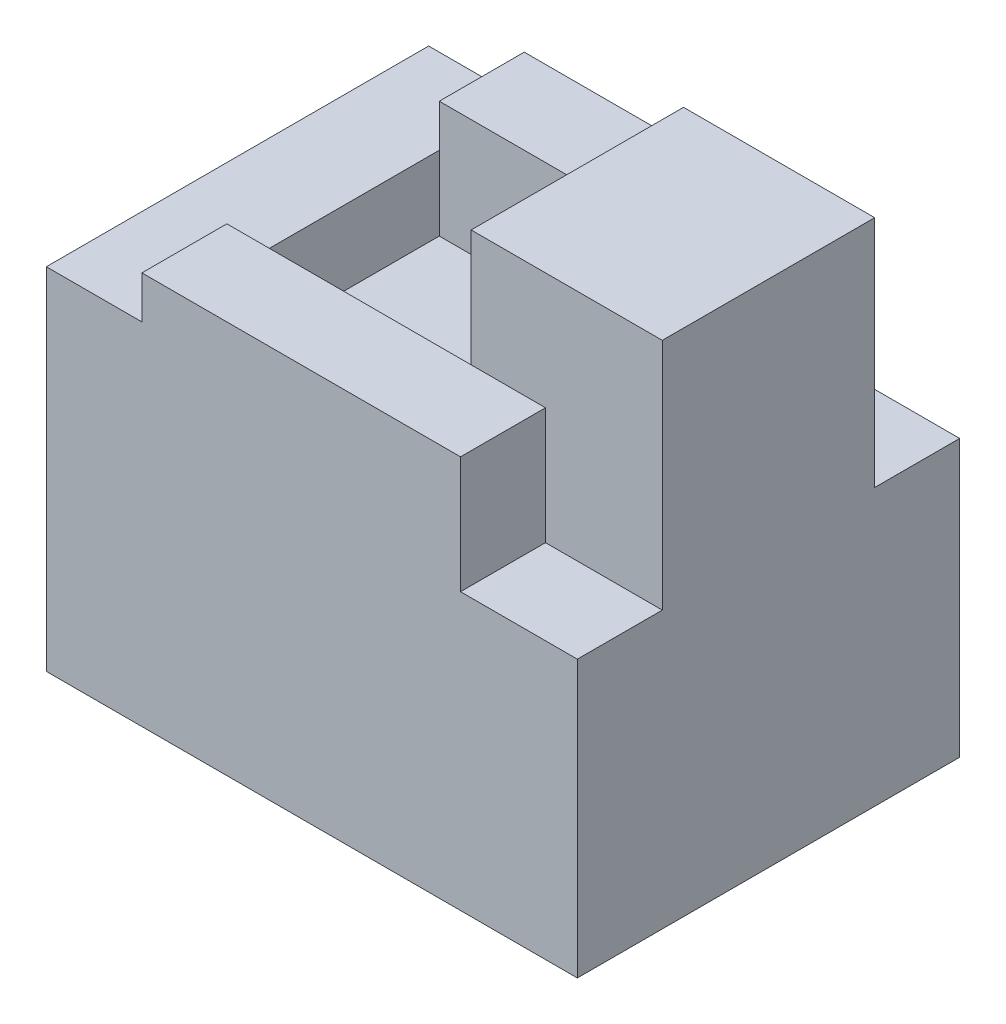
ISO-10303-21;
HEADER;
FILE_DESCRIPTION(('STEP AP214'),'2;1');
FILE_NAME('part.step','',(''),(''),'','','');
FILE_SCHEMA(('AUTOMOTIVE_DESIGN { 1 0 10303 214 1 1 1 1 }'));
ENDSEC;
DATA;
#1=APPLICATION_CONTEXT('core data for automotive mechanical design processes');
#2=APPLICATION_PROTOCOL_DEFINITION('international standard','automotive_design',2000,#1);
#3=PRODUCT_CONTEXT('',#1,'mechanical');
#4=PRODUCT('Part','Part','',(#3));
#5=PRODUCT_RELATED_PRODUCT_CATEGORY('part','',(#4));
#6=PRODUCT_DEFINITION_FORMATION('','',#4);
#7=PRODUCT_DEFINITION_CONTEXT('part definition',#1,'design');
#8=PRODUCT_DEFINITION('design','',#6,#7);
#9=PRODUCT_DEFINITION_SHAPE('','',#8);
#10=(LENGTH_UNIT() NAMED_UNIT(*) SI_UNIT(.MILLI.,.METRE.));
#11=(NAMED_UNIT(*) PLANE_ANGLE_UNIT() SI_UNIT($,.RADIAN.));
#12=(NAMED_UNIT(*) SI_UNIT($,.STERADIAN.) SOLID_ANGLE_UNIT());
#13=UNCERTAINTY_MEASURE_WITH_UNIT(LENGTH_MEASURE(1.E-05),#10,'distance_accuracy_value','');
#14=(GEOMETRIC_REPRESENTATION_CONTEXT(3) GLOBAL_UNCERTAINTY_ASSIGNED_CONTEXT((#13)) GLOBAL_UNIT_ASSIGNED_CONTEXT((#10,
#11,#12)) REPRESENTATION_CONTEXT('',''));
#15=CARTESIAN_POINT('',(0.,0.,0.));
#16=DIRECTION('',(0.,0.,1.));
#17=DIRECTION('',(1.,0.,0.));
#18=AXIS2_PLACEMENT_3D('',#15,#16,#17);
#19=CARTESIAN_POINT('',(0.,0.,0.));
#20=DIRECTION('',(0.,-1.,0.));
#21=DIRECTION('',(0.,0.,-1.));
#22=AXIS2_PLACEMENT_3D('',#19,#20,#21);
#23=PLANE('',#22);
#24=DIRECTION('',(-1.,0.,0.));
#25=VECTOR('',#24,1.);
#26=CARTESIAN_POINT('',(500.,0.,-280.));
#27=LINE('',#26,#25);
#28=CARTESIAN_POINT('',(500.,0.,-280.));
#29=VERTEX_POINT('',#28);
#30=CARTESIAN_POINT('',(390.,0.,-280.));
#31=VERTEX_POINT('',#30);
#32=EDGE_CURVE('E358',#29,#31,#27,.T.);
#33=ORIENTED_EDGE('',*,*,#32,.F.);
#34=DIRECTION('',(0.,0.,-1.));
#35=VECTOR('',#34,1.);
#36=CARTESIAN_POINT('',(500.,0.,0.));
#37=LINE('',#36,#35);
#38=CARTESIAN_POINT('',(500.,0.,-360.));
#39=VERTEX_POINT('',#38);
#40=EDGE_CURVE('E193',#29,#39,#37,.T.);
#41=ORIENTED_EDGE('',*,*,#40,.T.);
#42=DIRECTION('',(-1.,0.,0.));
#43=VECTOR('',#42,1.);
#44=CARTESIAN_POINT('',(0.,0.,-360.));
#45=LINE('',#44,#43);
#46=CARTESIAN_POINT('',(390.,0.,-360.));
#47=VERTEX_POINT('',#46);
#48=EDGE_CURVE('E273',#39,#47,#45,.T.);
#49=ORIENTED_EDGE('',*,*,#48,.T.);
#50=DIRECTION('',(0.,0.,-1.));
#51=VECTOR('',#50,1.);
#52=CARTESIAN_POINT('',(390.,0.,-360.));
#53=LINE('',#52,#51);
#54=EDGE_CURVE('E215',#31,#47,#53,.T.);
#55=ORIENTED_EDGE('',*,*,#54,.F.);
#56=EDGE_LOOP('',(#33,#41,#49,#55));
#57=FACE_BOUND('',#56,.T.);
#58=ADVANCED_FACE('F41',(#57),#23,.F.);
#59=DIRECTION('',(0.,0.,1.));
#60=VECTOR('',#59,1.);
#61=CARTESIAN_POINT('',(320.,0.,-280.));
#62=LINE('',#61,#60);
#63=CARTESIAN_POINT('',(320.,0.,-280.));
#64=VERTEX_POINT('',#63);
#65=CARTESIAN_POINT('',(320.,0.,-80.));
#66=VERTEX_POINT('',#65);
#67=EDGE_CURVE('E347',#64,#66,#62,.T.);
#68=ORIENTED_EDGE('',*,*,#67,.F.);
#69=DIRECTION('',(1.,0.,0.));
#70=VECTOR('',#69,1.);
#71=CARTESIAN_POINT('',(390.,0.,-280.));
#72=LINE('',#71,#70);
#73=CARTESIAN_POINT('',(90.,0.,-280.));
#74=VERTEX_POINT('',#73);
#75=EDGE_CURVE('E229',#74,#64,#72,.T.);
#76=ORIENTED_EDGE('',*,*,#75,.F.);
#77=DIRECTION('',(0.,0.,-1.));
#78=VECTOR('',#77,1.);
#79=CARTESIAN_POINT('',(90.,0.,-360.));
#80=LINE('',#79,#78);
#81=CARTESIAN_POINT('',(90.,0.,-80.));
#82=VERTEX_POINT('',#81);
#83=EDGE_CURVE('E252',#82,#74,#80,.T.);
#84=ORIENTED_EDGE('',*,*,#83,.F.);
#85=DIRECTION('',(-1.,0.,0.));
#86=VECTOR('',#85,1.);
#87=CARTESIAN_POINT('',(390.,0.,-80.));
#88=LINE('',#87,#86);
#89=EDGE_CURVE('E209',#66,#82,#88,.T.);
#90=ORIENTED_EDGE('',*,*,#89,.F.);
#91=EDGE_LOOP('',(#68,#76,#84,#90));
#92=FACE_BOUND('',#91,.T.);
#93=ADVANCED_FACE('F346',(#92),#23,.F.);
#94=DIRECTION('',(1.,0.,0.));
#95=VECTOR('',#94,1.);
#96=CARTESIAN_POINT('',(500.,0.,-80.));
#97=LINE('',#96,#95);
#98=CARTESIAN_POINT('',(390.,0.,-80.));
#99=VERTEX_POINT('',#98);
#100=CARTESIAN_POINT('',(500.,0.,-80.));
#101=VERTEX_POINT('',#100);
#102=EDGE_CURVE('E187',#99,#101,#97,.T.);
#103=ORIENTED_EDGE('',*,*,#102,.F.);
#104=DIRECTION('',(0.,0.,-1.));
#105=VECTOR('',#104,1.);
#106=CARTESIAN_POINT('',(390.,0.,0.));
#107=LINE('',#106,#105);
#108=CARTESIAN_POINT('',(390.,0.,0.));
#109=VERTEX_POINT('',#108);
#110=EDGE_CURVE('E211',#109,#99,#107,.T.);
#111=ORIENTED_EDGE('',*,*,#110,.F.);
#112=DIRECTION('',(1.,0.,0.));
#113=VECTOR('',#112,1.);
#114=CARTESIAN_POINT('',(0.,0.,0.));
#115=LINE('',#114,#113);
#116=CARTESIAN_POINT('',(500.,0.,0.));
#117=VERTEX_POINT('',#116);
#118=EDGE_CURVE('E267',#109,#117,#115,.T.);
#119=ORIENTED_EDGE('',*,*,#118,.T.);
#120=EDGE_CURVE('E283',#117,#101,#37,.T.);
#121=ORIENTED_EDGE('',*,*,#120,.T.);
#122=EDGE_LOOP('',(#103,#111,#119,#121));
#123=FACE_BOUND('',#122,.T.);
#124=ADVANCED_FACE('F317',(#123),#23,.F.);
#125=CARTESIAN_POINT('',(390.,110.,-280.));
#126=DIRECTION('',(0.,0.,-1.));
#127=DIRECTION('',(-1.,0.,0.));
#128=AXIS2_PLACEMENT_3D('',#125,#126,#127);
#129=PLANE('',#128);
#130=DIRECTION('',(0.,-1.,0.));
#131=VECTOR('',#130,1.);
#132=CARTESIAN_POINT('',(320.,220.,-280.));
#133=LINE('',#132,#131);
#134=CARTESIAN_POINT('',(320.,110.,-280.));
#135=VERTEX_POINT('',#134);
#136=EDGE_CURVE('E198',#135,#64,#133,.T.);
#137=ORIENTED_EDGE('',*,*,#136,.F.);
#138=DIRECTION('',(1.,0.,0.));
#139=VECTOR('',#138,1.);
#140=CARTESIAN_POINT('',(390.,110.,-280.));
#141=LINE('',#140,#139);
#142=CARTESIAN_POINT('',(90.,110.,-280.));
#143=VERTEX_POINT('',#142);
#144=EDGE_CURVE('E234',#143,#135,#141,.T.);
#145=ORIENTED_EDGE('',*,*,#144,.F.);
#146=DIRECTION('',(0.,-1.,0.));
#147=VECTOR('',#146,1.);
#148=CARTESIAN_POINT('',(90.,110.,-280.));
#149=LINE('',#148,#147);
#150=CARTESIAN_POINT('',(90.,70.,-280.));
#151=VERTEX_POINT('',#150);
#152=EDGE_CURVE('E245',#143,#151,#149,.T.);
#153=ORIENTED_EDGE('',*,*,#152,.T.);
#154=EDGE_CURVE('E244',#151,#74,#149,.T.);
#155=ORIENTED_EDGE('',*,*,#154,.T.);
#156=ORIENTED_EDGE('',*,*,#75,.T.);
#157=EDGE_LOOP('',(#137,#145,#153,#155,#156));
#158=FACE_BOUND('',#157,.T.);
#159=ADVANCED_FACE('F339',(#158),#129,.F.);
#160=CARTESIAN_POINT('',(390.,110.,-80.));
#161=DIRECTION('',(0.,0.,1.));
#162=DIRECTION('',(1.,0.,0.));
#163=AXIS2_PLACEMENT_3D('',#160,#161,#162);
#164=PLANE('',#163);
#165=DIRECTION('',(0.,-1.,0.));
#166=VECTOR('',#165,1.);
#167=CARTESIAN_POINT('',(320.,220.,-80.));
#168=LINE('',#167,#166);
#169=CARTESIAN_POINT('',(320.,110.,-80.));
#170=VERTEX_POINT('',#169);
#171=EDGE_CURVE('E365',#170,#66,#168,.T.);
#172=ORIENTED_EDGE('',*,*,#171,.T.);
#173=ORIENTED_EDGE('',*,*,#89,.T.);
#174=DIRECTION('',(0.,-1.,0.));
#175=VECTOR('',#174,1.);
#176=CARTESIAN_POINT('',(90.,110.,-80.));
#177=LINE('',#176,#175);
#178=CARTESIAN_POINT('',(90.,70.,-80.0000000000001));
#179=VERTEX_POINT('',#178);
#180=EDGE_CURVE('E196',#179,#82,#177,.T.);
#181=ORIENTED_EDGE('',*,*,#180,.F.);
#182=CARTESIAN_POINT('',(90.,110.,-80.));
#183=VERTEX_POINT('',#182);
#184=EDGE_CURVE('E66',#183,#179,#177,.T.);
#185=ORIENTED_EDGE('',*,*,#184,.F.);
#186=DIRECTION('',(-1.,0.,0.));
#187=VECTOR('',#186,1.);
#188=CARTESIAN_POINT('',(390.,110.,-80.));
#189=LINE('',#188,#187);
#190=EDGE_CURVE('E219',#170,#183,#189,.T.);
#191=ORIENTED_EDGE('',*,*,#190,.F.);
#192=EDGE_LOOP('',(#172,#173,#181,#185,#191));
#193=FACE_BOUND('',#192,.T.);
#194=ADVANCED_FACE('F368',(#193),#164,.F.);
#195=CARTESIAN_POINT('',(90.,70.,-360.));
#196=DIRECTION('',(-1.,0.,0.));
#197=DIRECTION('',(0.,0.,1.));
#198=AXIS2_PLACEMENT_3D('',#195,#196,#197);
#199=PLANE('',#198);
#200=ORIENTED_EDGE('',*,*,#180,.T.);
#201=ORIENTED_EDGE('',*,*,#83,.T.);
#202=ORIENTED_EDGE('',*,*,#154,.F.);
#203=DIRECTION('',(0.,0.,-1.));
#204=VECTOR('',#203,1.);
#205=CARTESIAN_POINT('',(90.,70.,-360.));
#206=LINE('',#205,#204);
#207=EDGE_CURVE('E264',#179,#151,#206,.T.);
#208=ORIENTED_EDGE('',*,*,#207,.F.);
#209=EDGE_LOOP('',(#200,#201,#202,#208));
#210=FACE_BOUND('',#209,.T.);
#211=ADVANCED_FACE('F341',(#210),#199,.F.);
#212=CARTESIAN_POINT('',(0.,-260.,0.));
#213=DIRECTION('',(-1.,0.,0.));
#214=DIRECTION('',(0.,0.,1.));
#215=AXIS2_PLACEMENT_3D('',#212,#213,#214);
#216=PLANE('',#215);
#217=DIRECTION('',(0.,1.,0.));
#218=VECTOR('',#217,1.);
#219=CARTESIAN_POINT('',(0.,-260.,0.));
#220=LINE('',#219,#218);
#221=CARTESIAN_POINT('',(0.,-260.,0.));
#222=VERTEX_POINT('',#221);
#223=CARTESIAN_POINT('',(0.,70.,0.));
#224=VERTEX_POINT('',#223);
#225=EDGE_CURVE('E45',#222,#224,#220,.T.);
#226=ORIENTED_EDGE('',*,*,#225,.T.);
#227=DIRECTION('',(0.,0.,1.));
#228=VECTOR('',#227,1.);
#229=CARTESIAN_POINT('',(0.,70.,-360.));
#230=LINE('',#229,#228);
#231=CARTESIAN_POINT('',(0.,70.,-360.));
#232=VERTEX_POINT('',#231);
#233=EDGE_CURVE('E253',#232,#224,#230,.T.);
#234=ORIENTED_EDGE('',*,*,#233,.F.);
#235=DIRECTION('',(0.,1.,0.));
#236=VECTOR('',#235,1.);
#237=CARTESIAN_POINT('',(0.,-260.,-360.));
#238=LINE('',#237,#236);
#239=CARTESIAN_POINT('',(0.,-260.,-360.));
#240=VERTEX_POINT('',#239);
#241=EDGE_CURVE('E11',#240,#232,#238,.T.);
#242=ORIENTED_EDGE('',*,*,#241,.F.);
#243=DIRECTION('',(0.,0.,1.));
#244=VECTOR('',#243,1.);
#245=CARTESIAN_POINT('',(0.,-260.,0.));
#246=LINE('',#245,#244);
#247=EDGE_CURVE('E269',#240,#222,#246,.T.);
#248=ORIENTED_EDGE('',*,*,#247,.T.);
#249=EDGE_LOOP('',(#226,#234,#242,#248));
#250=FACE_BOUND('',#249,.T.);
#251=ADVANCED_FACE('F43',(#250),#216,.T.);
#252=CARTESIAN_POINT('',(0.,-260.,-360.));
#253=DIRECTION('',(0.,0.,-1.));
#254=DIRECTION('',(-1.,0.,0.));
#255=AXIS2_PLACEMENT_3D('',#252,#253,#254);
#256=PLANE('',#255);
#257=ORIENTED_EDGE('',*,*,#48,.F.);
#258=DIRECTION('',(0.,1.,0.));
#259=VECTOR('',#258,1.);
#260=CARTESIAN_POINT('',(500.,-260.,-360.));
#261=LINE('',#260,#259);
#262=CARTESIAN_POINT('',(500.,-260.,-360.));
#263=VERTEX_POINT('',#262);
#264=EDGE_CURVE('E50',#263,#39,#261,.T.);
#265=ORIENTED_EDGE('',*,*,#264,.F.);
#266=DIRECTION('',(-1.,0.,0.));
#267=VECTOR('',#266,1.);
#268=CARTESIAN_POINT('',(0.,-260.,-360.));
#269=LINE('',#268,#267);
#270=EDGE_CURVE('E279',#263,#240,#269,.T.);
#271=ORIENTED_EDGE('',*,*,#270,.T.);
#272=ORIENTED_EDGE('',*,*,#241,.T.);
#273=DIRECTION('',(-1.,0.,0.));
#274=VECTOR('',#273,1.);
#275=CARTESIAN_POINT('',(0.,70.,-360.));
#276=LINE('',#275,#274);
#277=CARTESIAN_POINT('',(90.,70.,-360.));
#278=VERTEX_POINT('',#277);
#279=EDGE_CURVE('E263',#278,#232,#276,.T.);
#280=ORIENTED_EDGE('',*,*,#279,.F.);
#281=DIRECTION('',(0.,-1.,0.));
#282=VECTOR('',#281,1.);
#283=CARTESIAN_POINT('',(90.,110.,-360.));
#284=LINE('',#283,#282);
#285=CARTESIAN_POINT('',(90.,110.,-360.));
#286=VERTEX_POINT('',#285);
#287=EDGE_CURVE('E248',#286,#278,#284,.T.);
#288=ORIENTED_EDGE('',*,*,#287,.F.);
#289=DIRECTION('',(-1.,0.,0.));
#290=VECTOR('',#289,1.);
#291=CARTESIAN_POINT('',(390.,110.,-360.));
#292=LINE('',#291,#290);
#293=CARTESIAN_POINT('',(390.,110.,-360.));
#294=VERTEX_POINT('',#293);
#295=EDGE_CURVE('E228',#294,#286,#292,.T.);
#296=ORIENTED_EDGE('',*,*,#295,.F.);
#297=DIRECTION('',(0.,-1.,0.));
#298=VECTOR('',#297,1.);
#299=CARTESIAN_POINT('',(390.,110.,-360.));
#300=LINE('',#299,#298);
#301=EDGE_CURVE('E250',#294,#47,#300,.T.);
#302=ORIENTED_EDGE('',*,*,#301,.T.);
#303=EDGE_LOOP('',(#257,#265,#271,#272,#280,#288,#296,#302));
#304=FACE_BOUND('',#303,.T.);
#305=ADVANCED_FACE('F308',(#304),#256,.T.);
#306=CARTESIAN_POINT('',(500.,-260.,0.));
#307=DIRECTION('',(1.,0.,0.));
#308=DIRECTION('',(0.,0.,-1.));
#309=AXIS2_PLACEMENT_3D('',#306,#307,#308);
#310=PLANE('',#309);
#311=ORIENTED_EDGE('',*,*,#120,.F.);
#312=DIRECTION('',(0.,1.,0.));
#313=VECTOR('',#312,1.);
#314=CARTESIAN_POINT('',(500.,-260.,0.));
#315=LINE('',#314,#313);
#316=CARTESIAN_POINT('',(500.,-260.,0.));
#317=VERTEX_POINT('',#316);
#318=EDGE_CURVE('E288',#317,#117,#315,.T.);
#319=ORIENTED_EDGE('',*,*,#318,.F.);
#320=DIRECTION('',(0.,0.,-1.));
#321=VECTOR('',#320,1.);
#322=CARTESIAN_POINT('',(500.,-260.,0.));
#323=LINE('',#322,#321);
#324=EDGE_CURVE('E276',#317,#263,#323,.T.);
#325=ORIENTED_EDGE('',*,*,#324,.T.);
#326=ORIENTED_EDGE('',*,*,#264,.T.);
#327=ORIENTED_EDGE('',*,*,#40,.F.);
#328=DIRECTION('',(0.,-1.,0.));
#329=VECTOR('',#328,1.);
#330=CARTESIAN_POINT('',(500.,220.,-280.));
#331=LINE('',#330,#329);
#332=CARTESIAN_POINT('',(500.,220.,-280.));
#333=VERTEX_POINT('',#332);
#334=EDGE_CURVE('E172',#333,#29,#331,.T.);
#335=ORIENTED_EDGE('',*,*,#334,.F.);
#336=DIRECTION('',(0.,0.,-1.));
#337=VECTOR('',#336,1.);
#338=CARTESIAN_POINT('',(500.,220.,-280.));
#339=LINE('',#338,#337);
#340=CARTESIAN_POINT('',(500.,220.,-80.));
#341=VERTEX_POINT('',#340);
#342=EDGE_CURVE('E179',#341,#333,#339,.T.);
#343=ORIENTED_EDGE('',*,*,#342,.F.);
#344=DIRECTION('',(0.,-1.,0.));
#345=VECTOR('',#344,1.);
#346=CARTESIAN_POINT('',(500.,220.,-80.));
#347=LINE('',#346,#345);
#348=EDGE_CURVE('E314',#341,#101,#347,.T.);
#349=ORIENTED_EDGE('',*,*,#348,.T.);
#350=EDGE_LOOP('',(#311,#319,#325,#326,#327,#335,#343,#349));
#351=FACE_BOUND('',#350,.T.);
#352=ADVANCED_FACE('F191',(#351),#310,.T.);
#353=CARTESIAN_POINT('',(0.,-260.,0.));
#354=DIRECTION('',(0.,0.,1.));
#355=DIRECTION('',(1.,0.,0.));
#356=AXIS2_PLACEMENT_3D('',#353,#354,#355);
#357=PLANE('',#356);
#358=ORIENTED_EDGE('',*,*,#118,.F.);
#359=DIRECTION('',(0.,-1.,0.));
#360=VECTOR('',#359,1.);
#361=CARTESIAN_POINT('',(390.,110.,0.));
#362=LINE('',#361,#360);
#363=CARTESIAN_POINT('',(390.,110.,0.));
#364=VERTEX_POINT('',#363);
#365=EDGE_CURVE('E206',#364,#109,#362,.T.);
#366=ORIENTED_EDGE('',*,*,#365,.F.);
#367=DIRECTION('',(1.,0.,0.));
#368=VECTOR('',#367,1.);
#369=CARTESIAN_POINT('',(390.,110.,0.));
#370=LINE('',#369,#368);
#371=CARTESIAN_POINT('',(90.,110.,0.));
#372=VERTEX_POINT('',#371);
#373=EDGE_CURVE('E208',#372,#364,#370,.T.);
#374=ORIENTED_EDGE('',*,*,#373,.F.);
#375=DIRECTION('',(0.,-1.,0.));
#376=VECTOR('',#375,1.);
#377=CARTESIAN_POINT('',(90.,110.,0.));
#378=LINE('',#377,#376);
#379=CARTESIAN_POINT('',(90.,70.,0.));
#380=VERTEX_POINT('',#379);
#381=EDGE_CURVE('E203',#372,#380,#378,.T.);
#382=ORIENTED_EDGE('',*,*,#381,.T.);
#383=DIRECTION('',(1.,0.,0.));
#384=VECTOR('',#383,1.);
#385=CARTESIAN_POINT('',(0.,70.,0.));
#386=LINE('',#385,#384);
#387=EDGE_CURVE('E256',#224,#380,#386,.T.);
#388=ORIENTED_EDGE('',*,*,#387,.F.);
#389=ORIENTED_EDGE('',*,*,#225,.F.);
#390=DIRECTION('',(1.,0.,0.));
#391=VECTOR('',#390,1.);
#392=CARTESIAN_POINT('',(0.,-260.,0.));
#393=LINE('',#392,#391);
#394=EDGE_CURVE('E272',#222,#317,#393,.T.);
#395=ORIENTED_EDGE('',*,*,#394,.T.);
#396=ORIENTED_EDGE('',*,*,#318,.T.);
#397=EDGE_LOOP('',(#358,#366,#374,#382,#388,#389,#395,#396));
#398=FACE_BOUND('',#397,.T.);
#399=ADVANCED_FACE('F297',(#398),#357,.T.);
#400=CARTESIAN_POINT('',(0.,-260.,0.));
#401=DIRECTION('',(0.,-1.,0.));
#402=DIRECTION('',(0.,0.,-1.));
#403=AXIS2_PLACEMENT_3D('',#400,#401,#402);
#404=PLANE('',#403);
#405=ORIENTED_EDGE('',*,*,#247,.F.);
#406=ORIENTED_EDGE('',*,*,#270,.F.);
#407=ORIENTED_EDGE('',*,*,#324,.F.);
#408=ORIENTED_EDGE('',*,*,#394,.F.);
#409=EDGE_LOOP('',(#405,#406,#407,#408));
#410=FACE_BOUND('',#409,.T.);
#411=ADVANCED_FACE('F312',(#410),#404,.T.);
#412=CARTESIAN_POINT('',(0.,70.,0.));
#413=DIRECTION('',(0.,1.,0.));
#414=DIRECTION('',(0.,0.,1.));
#415=AXIS2_PLACEMENT_3D('',#412,#413,#414);
#416=PLANE('',#415);
#417=ORIENTED_EDGE('',*,*,#233,.T.);
#418=ORIENTED_EDGE('',*,*,#387,.T.);
#419=EDGE_CURVE('E260',#380,#179,#206,.T.);
#420=ORIENTED_EDGE('',*,*,#419,.T.);
#421=ORIENTED_EDGE('',*,*,#207,.T.);
#422=EDGE_CURVE('E259',#151,#278,#206,.T.);
#423=ORIENTED_EDGE('',*,*,#422,.T.);
#424=ORIENTED_EDGE('',*,*,#279,.T.);
#425=EDGE_LOOP('',(#417,#418,#420,#421,#423,#424));
#426=FACE_BOUND('',#425,.T.);
#427=ADVANCED_FACE('F301',(#426),#416,.T.);
#428=CARTESIAN_POINT('',(390.,110.,-360.));
#429=DIRECTION('',(-1.,0.,0.));
#430=DIRECTION('',(0.,0.,1.));
#431=AXIS2_PLACEMENT_3D('',#428,#429,#430);
#432=PLANE('',#431);
#433=ORIENTED_EDGE('',*,*,#54,.T.);
#434=ORIENTED_EDGE('',*,*,#301,.F.);
#435=DIRECTION('',(0.,0.,-1.));
#436=VECTOR('',#435,1.);
#437=CARTESIAN_POINT('',(390.,110.,-360.));
#438=LINE('',#437,#436);
#439=CARTESIAN_POINT('',(390.,110.,-280.));
#440=VERTEX_POINT('',#439);
#441=EDGE_CURVE('E225',#440,#294,#438,.T.);
#442=ORIENTED_EDGE('',*,*,#441,.F.);
#443=DIRECTION('',(0.,-1.,0.));
#444=VECTOR('',#443,1.);
#445=CARTESIAN_POINT('',(390.,110.,-280.));
#446=LINE('',#445,#444);
#447=EDGE_CURVE('E237',#440,#31,#446,.T.);
#448=ORIENTED_EDGE('',*,*,#447,.T.);
#449=EDGE_LOOP('',(#433,#434,#442,#448));
#450=FACE_BOUND('',#449,.T.);
#451=ADVANCED_FACE('F356',(#450),#432,.F.);
#452=CARTESIAN_POINT('',(90.,110.,-360.));
#453=DIRECTION('',(1.,0.,0.));
#454=DIRECTION('',(0.,0.,-1.));
#455=AXIS2_PLACEMENT_3D('',#452,#453,#454);
#456=PLANE('',#455);
#457=ORIENTED_EDGE('',*,*,#422,.F.);
#458=ORIENTED_EDGE('',*,*,#152,.F.);
#459=DIRECTION('',(0.,0.,1.));
#460=VECTOR('',#459,1.);
#461=CARTESIAN_POINT('',(90.,110.,-360.));
#462=LINE('',#461,#460);
#463=EDGE_CURVE('E231',#286,#143,#462,.T.);
#464=ORIENTED_EDGE('',*,*,#463,.F.);
#465=ORIENTED_EDGE('',*,*,#287,.T.);
#466=EDGE_LOOP('',(#457,#458,#464,#465));
#467=FACE_BOUND('',#466,.T.);
#468=ADVANCED_FACE('F334',(#467),#456,.F.);
#469=CARTESIAN_POINT('',(0.,110.,0.));
#470=DIRECTION('',(0.,-1.,0.));
#471=DIRECTION('',(0.,0.,-1.));
#472=AXIS2_PLACEMENT_3D('',#469,#470,#471);
#473=PLANE('',#472);
#474=ORIENTED_EDGE('',*,*,#441,.T.);
#475=ORIENTED_EDGE('',*,*,#295,.T.);
#476=ORIENTED_EDGE('',*,*,#463,.T.);
#477=ORIENTED_EDGE('',*,*,#144,.T.);
#478=EDGE_CURVE('E233',#135,#440,#141,.T.);
#479=ORIENTED_EDGE('',*,*,#478,.T.);
#480=EDGE_LOOP('',(#474,#475,#476,#477,#479));
#481=FACE_BOUND('',#480,.T.);
#482=ADVANCED_FACE('F351',(#481),#473,.F.);
#483=CARTESIAN_POINT('',(390.,110.,0.));
#484=DIRECTION('',(-1.,0.,0.));
#485=DIRECTION('',(0.,0.,1.));
#486=AXIS2_PLACEMENT_3D('',#483,#484,#485);
#487=PLANE('',#486);
#488=ORIENTED_EDGE('',*,*,#110,.T.);
#489=DIRECTION('',(0.,-1.,0.));
#490=VECTOR('',#489,1.);
#491=CARTESIAN_POINT('',(390.,110.,-80.));
#492=LINE('',#491,#490);
#493=CARTESIAN_POINT('',(390.,110.,-80.));
#494=VERTEX_POINT('',#493);
#495=EDGE_CURVE('E194',#494,#99,#492,.T.);
#496=ORIENTED_EDGE('',*,*,#495,.F.);
#497=DIRECTION('',(0.,0.,-1.));
#498=VECTOR('',#497,1.);
#499=CARTESIAN_POINT('',(390.,110.,0.));
#500=LINE('',#499,#498);
#501=EDGE_CURVE('E212',#364,#494,#500,.T.);
#502=ORIENTED_EDGE('',*,*,#501,.F.);
#503=ORIENTED_EDGE('',*,*,#365,.T.);
#504=EDGE_LOOP('',(#488,#496,#502,#503));
#505=FACE_BOUND('',#504,.T.);
#506=ADVANCED_FACE('F323',(#505),#487,.F.);
#507=CARTESIAN_POINT('',(90.,110.,0.));
#508=DIRECTION('',(1.,0.,0.));
#509=DIRECTION('',(0.,0.,-1.));
#510=AXIS2_PLACEMENT_3D('',#507,#508,#509);
#511=PLANE('',#510);
#512=ORIENTED_EDGE('',*,*,#419,.F.);
#513=ORIENTED_EDGE('',*,*,#381,.F.);
#514=DIRECTION('',(0.,0.,1.));
#515=VECTOR('',#514,1.);
#516=CARTESIAN_POINT('',(90.,110.,0.));
#517=LINE('',#516,#515);
#518=EDGE_CURVE('E217',#183,#372,#517,.T.);
#519=ORIENTED_EDGE('',*,*,#518,.F.);
#520=ORIENTED_EDGE('',*,*,#184,.T.);
#521=EDGE_LOOP('',(#512,#513,#519,#520));
#522=FACE_BOUND('',#521,.T.);
#523=ADVANCED_FACE('F327',(#522),#511,.F.);
#524=CARTESIAN_POINT('',(0.,110.,0.));
#525=DIRECTION('',(0.,1.,0.));
#526=DIRECTION('',(0.,0.,1.));
#527=AXIS2_PLACEMENT_3D('',#524,#525,#526);
#528=PLANE('',#527);
#529=ORIENTED_EDGE('',*,*,#501,.T.);
#530=EDGE_CURVE('E220',#494,#170,#189,.T.);
#531=ORIENTED_EDGE('',*,*,#530,.T.);
#532=ORIENTED_EDGE('',*,*,#190,.T.);
#533=ORIENTED_EDGE('',*,*,#518,.T.);
#534=ORIENTED_EDGE('',*,*,#373,.T.);
#535=EDGE_LOOP('',(#529,#531,#532,#533,#534));
#536=FACE_BOUND('',#535,.T.);
#537=ADVANCED_FACE('F325',(#536),#528,.T.);
#538=CARTESIAN_POINT('',(500.,220.,-280.));
#539=DIRECTION('',(0.,0.,1.));
#540=DIRECTION('',(1.,0.,0.));
#541=AXIS2_PLACEMENT_3D('',#538,#539,#540);
#542=PLANE('',#541);
#543=ORIENTED_EDGE('',*,*,#32,.T.);
#544=ORIENTED_EDGE('',*,*,#447,.F.);
#545=ORIENTED_EDGE('',*,*,#478,.F.);
#546=CARTESIAN_POINT('',(320.,220.,-280.));
#547=VERTEX_POINT('',#546);
#548=EDGE_CURVE('E175',#547,#135,#133,.T.);
#549=ORIENTED_EDGE('',*,*,#548,.F.);
#550=DIRECTION('',(-1.,0.,0.));
#551=VECTOR('',#550,1.);
#552=CARTESIAN_POINT('',(500.,220.,-280.));
#553=LINE('',#552,#551);
#554=EDGE_CURVE('E168',#333,#547,#553,.T.);
#555=ORIENTED_EDGE('',*,*,#554,.F.);
#556=ORIENTED_EDGE('',*,*,#334,.T.);
#557=EDGE_LOOP('',(#543,#544,#545,#549,#555,#556));
#558=FACE_BOUND('',#557,.T.);
#559=ADVANCED_FACE('F170',(#558),#542,.F.);
#560=CARTESIAN_POINT('',(500.,220.,-80.));
#561=DIRECTION('',(0.,0.,-1.));
#562=DIRECTION('',(-1.,0.,0.));
#563=AXIS2_PLACEMENT_3D('',#560,#561,#562);
#564=PLANE('',#563);
#565=ORIENTED_EDGE('',*,*,#530,.F.);
#566=ORIENTED_EDGE('',*,*,#495,.T.);
#567=ORIENTED_EDGE('',*,*,#102,.T.);
#568=ORIENTED_EDGE('',*,*,#348,.F.);
#569=DIRECTION('',(1.,0.,0.));
#570=VECTOR('',#569,1.);
#571=CARTESIAN_POINT('',(500.,220.,-80.));
#572=LINE('',#571,#570);
#573=CARTESIAN_POINT('',(320.,220.,-80.));
#574=VERTEX_POINT('',#573);
#575=EDGE_CURVE('E183',#574,#341,#572,.T.);
#576=ORIENTED_EDGE('',*,*,#575,.F.);
#577=EDGE_CURVE('E58',#574,#170,#168,.T.);
#578=ORIENTED_EDGE('',*,*,#577,.T.);
#579=EDGE_LOOP('',(#565,#566,#567,#568,#576,#578));
#580=FACE_BOUND('',#579,.T.);
#581=ADVANCED_FACE('F370',(#580),#564,.F.);
#582=CARTESIAN_POINT('',(320.,220.,-280.));
#583=DIRECTION('',(1.,0.,0.));
#584=DIRECTION('',(0.,0.,-1.));
#585=AXIS2_PLACEMENT_3D('',#582,#583,#584);
#586=PLANE('',#585);
#587=ORIENTED_EDGE('',*,*,#67,.T.);
#588=ORIENTED_EDGE('',*,*,#171,.F.);
#589=ORIENTED_EDGE('',*,*,#577,.F.);
#590=DIRECTION('',(0.,0.,1.));
#591=VECTOR('',#590,1.);
#592=CARTESIAN_POINT('',(320.,220.,-280.));
#593=LINE('',#592,#591);
#594=EDGE_CURVE('E178',#547,#574,#593,.T.);
#595=ORIENTED_EDGE('',*,*,#594,.F.);
#596=ORIENTED_EDGE('',*,*,#548,.T.);
#597=ORIENTED_EDGE('',*,*,#136,.T.);
#598=EDGE_LOOP('',(#587,#588,#589,#595,#596,#597));
#599=FACE_BOUND('',#598,.T.);
#600=ADVANCED_FACE('F369',(#599),#586,.F.);
#601=CARTESIAN_POINT('',(0.,220.,0.));
#602=DIRECTION('',(0.,-1.,0.));
#603=DIRECTION('',(0.,0.,-1.));
#604=AXIS2_PLACEMENT_3D('',#601,#602,#603);
#605=PLANE('',#604);
#606=ORIENTED_EDGE('',*,*,#342,.T.);
#607=ORIENTED_EDGE('',*,*,#554,.T.);
#608=ORIENTED_EDGE('',*,*,#594,.T.);
#609=ORIENTED_EDGE('',*,*,#575,.T.);
#610=EDGE_LOOP('',(#606,#607,#608,#609));
#611=FACE_BOUND('',#610,.T.);
#612=ADVANCED_FACE('F182',(#611),#605,.F.);
#613=CLOSED_SHELL('',(#58,#93,#124,#159,#194,#211,#251,#305,#352,#399,#411,#427,#451,#468,#482,
#506,#523,#537,#559,#581,#600,#612));
#614=MANIFOLD_SOLID_BREP('B2',#613);
#615=ADVANCED_BREP_SHAPE_REPRESENTATION('',(#18,#614),#14);
#616=SHAPE_DEFINITION_REPRESENTATION(#9,#615);
ENDSEC;
END-ISO-10303-21;
